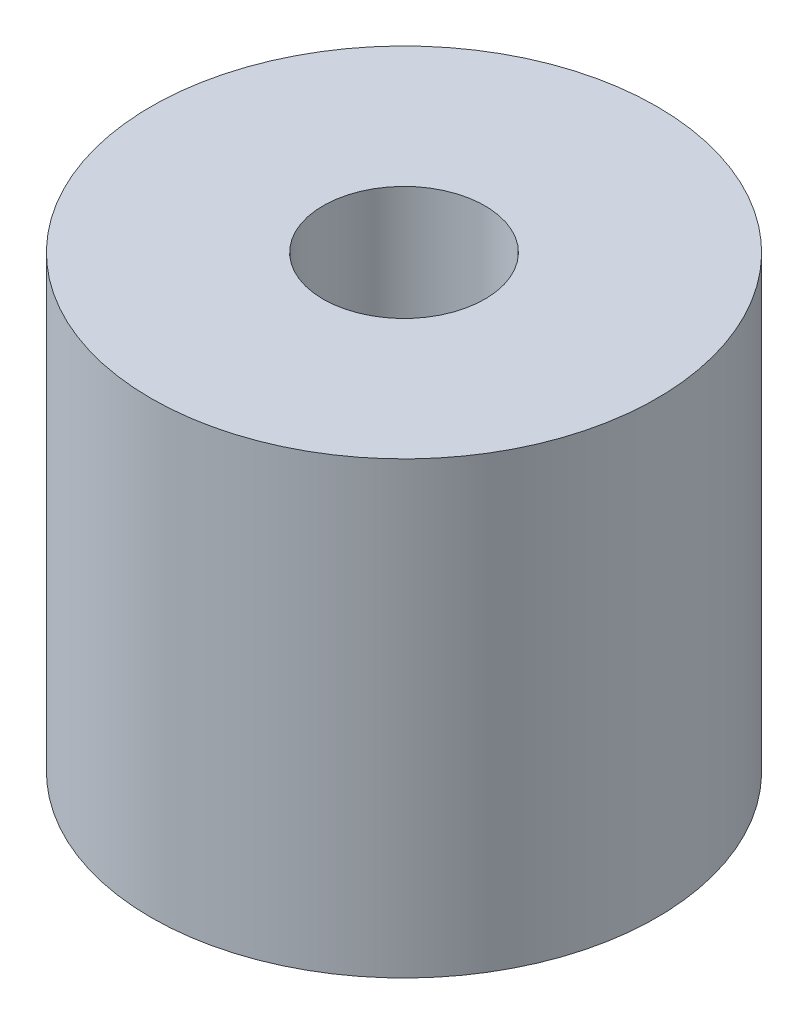
ISO-10303-21;
HEADER;
FILE_DESCRIPTION(('STEP AP214'),'2;1');
FILE_NAME('part.step','',(''),(''),'','','');
FILE_SCHEMA(('AUTOMOTIVE_DESIGN { 1 0 10303 214 1 1 1 1 }'));
ENDSEC;
DATA;
#1=APPLICATION_CONTEXT('core data for automotive mechanical design processes');
#2=APPLICATION_PROTOCOL_DEFINITION('international standard','automotive_design',2000,#1);
#3=PRODUCT_CONTEXT('',#1,'mechanical');
#4=PRODUCT('Part','Part','',(#3));
#5=PRODUCT_RELATED_PRODUCT_CATEGORY('part','',(#4));
#6=PRODUCT_DEFINITION_FORMATION('','',#4);
#7=PRODUCT_DEFINITION_CONTEXT('part definition',#1,'design');
#8=PRODUCT_DEFINITION('design','',#6,#7);
#9=PRODUCT_DEFINITION_SHAPE('','',#8);
#10=(LENGTH_UNIT() NAMED_UNIT(*) SI_UNIT(.MILLI.,.METRE.));
#11=(NAMED_UNIT(*) PLANE_ANGLE_UNIT() SI_UNIT($,.RADIAN.));
#12=(NAMED_UNIT(*) SI_UNIT($,.STERADIAN.) SOLID_ANGLE_UNIT());
#13=UNCERTAINTY_MEASURE_WITH_UNIT(LENGTH_MEASURE(1.E-05),#10,'distance_accuracy_value','');
#14=(GEOMETRIC_REPRESENTATION_CONTEXT(3) GLOBAL_UNCERTAINTY_ASSIGNED_CONTEXT((#13)) GLOBAL_UNIT_ASSIGNED_CONTEXT((#10,
#11,#12)) REPRESENTATION_CONTEXT('',''));
#15=CARTESIAN_POINT('',(0.,0.,0.));
#16=DIRECTION('',(0.,0.,1.));
#17=DIRECTION('',(1.,0.,0.));
#18=AXIS2_PLACEMENT_3D('',#15,#16,#17);
#19=CARTESIAN_POINT('',(0.,12.7,0.));
#20=DIRECTION('',(0.,1.,0.));
#21=DIRECTION('',(0.,0.,1.));
#22=AXIS2_PLACEMENT_3D('',#19,#20,#21);
#23=PLANE('',#22);
#24=CARTESIAN_POINT('',(0.,12.7,0.));
#25=DIRECTION('',(0.,1.,0.));
#26=DIRECTION('',(0.,0.,1.));
#27=AXIS2_PLACEMENT_3D('',#24,#25,#26);
#28=CIRCLE('',#27,7.14375);
#29=CARTESIAN_POINT('',(0.,12.7,7.14375));
#30=VERTEX_POINT('',#29);
#31=EDGE_CURVE('E10',#30,#30,#28,.T.);
#32=ORIENTED_EDGE('',*,*,#31,.T.);
#33=EDGE_LOOP('',(#32));
#34=FACE_BOUND('',#33,.T.);
#35=CARTESIAN_POINT('',(0.,12.7,0.));
#36=DIRECTION('',(0.,1.,0.));
#37=DIRECTION('',(0.,0.,1.));
#38=AXIS2_PLACEMENT_3D('',#35,#36,#37);
#39=CIRCLE('',#38,2.286);
#40=CARTESIAN_POINT('',(0.,12.7,2.286));
#41=VERTEX_POINT('',#40);
#42=EDGE_CURVE('E56',#41,#41,#39,.T.);
#43=ORIENTED_EDGE('',*,*,#42,.F.);
#44=EDGE_LOOP('',(#43));
#45=FACE_BOUND('',#44,.T.);
#46=ADVANCED_FACE('F43',(#34,#45),#23,.T.);
#47=CARTESIAN_POINT('',(0.,0.,0.));
#48=DIRECTION('',(0.,1.,0.));
#49=DIRECTION('',(0.,0.,1.));
#50=AXIS2_PLACEMENT_3D('',#47,#48,#49);
#51=PLANE('',#50);
#52=CARTESIAN_POINT('',(0.,0.,0.));
#53=DIRECTION('',(0.,1.,0.));
#54=DIRECTION('',(0.,0.,1.));
#55=AXIS2_PLACEMENT_3D('',#52,#53,#54);
#56=CIRCLE('',#55,7.14375);
#57=CARTESIAN_POINT('',(0.,0.,7.14375));
#58=VERTEX_POINT('',#57);
#59=EDGE_CURVE('E47',#58,#58,#56,.T.);
#60=ORIENTED_EDGE('',*,*,#59,.F.);
#61=EDGE_LOOP('',(#60));
#62=FACE_BOUND('',#61,.T.);
#63=CARTESIAN_POINT('',(0.,0.,0.));
#64=DIRECTION('',(0.,1.,0.));
#65=DIRECTION('',(0.,0.,1.));
#66=AXIS2_PLACEMENT_3D('',#63,#64,#65);
#67=CIRCLE('',#66,2.286);
#68=CARTESIAN_POINT('',(0.,0.,2.286));
#69=VERTEX_POINT('',#68);
#70=EDGE_CURVE('E58',#69,#69,#67,.T.);
#71=ORIENTED_EDGE('',*,*,#70,.T.);
#72=EDGE_LOOP('',(#71));
#73=FACE_BOUND('',#72,.T.);
#74=ADVANCED_FACE('F70',(#62,#73),#51,.F.);
#75=CARTESIAN_POINT('',(0.,12.7,0.));
#76=DIRECTION('',(0.,-1.,0.));
#77=DIRECTION('',(0.,0.,-1.));
#78=AXIS2_PLACEMENT_3D('',#75,#76,#77);
#79=CYLINDRICAL_SURFACE('',#78,7.14375);
#80=ORIENTED_EDGE('',*,*,#31,.F.);
#81=EDGE_LOOP('',(#80));
#82=FACE_BOUND('',#81,.T.);
#83=ORIENTED_EDGE('',*,*,#59,.T.);
#84=EDGE_LOOP('',(#83));
#85=FACE_BOUND('',#84,.T.);
#86=ADVANCED_FACE('F45',(#82,#85),#79,.T.);
#87=CARTESIAN_POINT('',(0.,12.7,0.));
#88=DIRECTION('',(0.,-1.,0.));
#89=DIRECTION('',(0.,0.,-1.));
#90=AXIS2_PLACEMENT_3D('',#87,#88,#89);
#91=CYLINDRICAL_SURFACE('',#90,2.286);
#92=ORIENTED_EDGE('',*,*,#42,.T.);
#93=EDGE_LOOP('',(#92));
#94=FACE_BOUND('',#93,.T.);
#95=ORIENTED_EDGE('',*,*,#70,.F.);
#96=EDGE_LOOP('',(#95));
#97=FACE_BOUND('',#96,.T.);
#98=ADVANCED_FACE('F66',(#94,#97),#91,.F.);
#99=CLOSED_SHELL('',(#46,#74,#86,#98));
#100=MANIFOLD_SOLID_BREP('B2',#99);
#101=ADVANCED_BREP_SHAPE_REPRESENTATION('',(#18,#100),#14);
#102=SHAPE_DEFINITION_REPRESENTATION(#9,#101);
ENDSEC;
END-ISO-10303-21;
